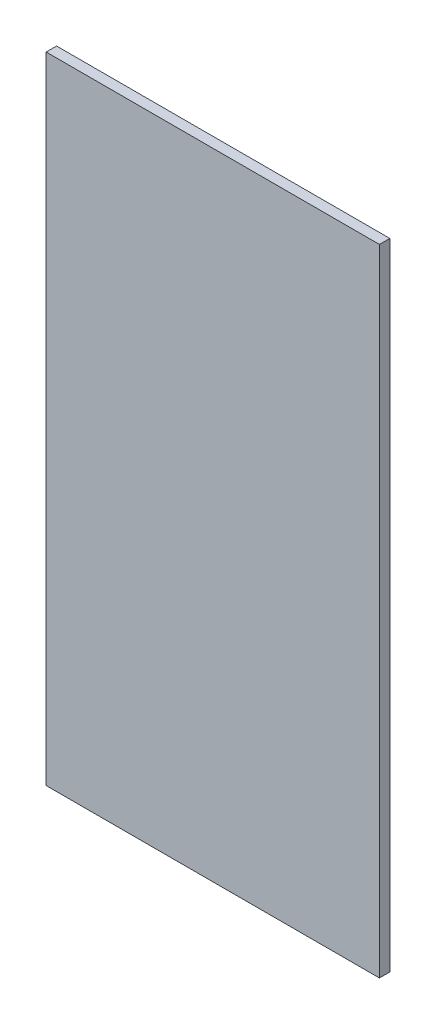
ISO-10303-21;
HEADER;
FILE_DESCRIPTION(('STEP AP214'),'2;1');
FILE_NAME('part.step','',(''),(''),'','','');
FILE_SCHEMA(('AUTOMOTIVE_DESIGN { 1 0 10303 214 1 1 1 1 }'));
ENDSEC;
DATA;
#1=APPLICATION_CONTEXT('core data for automotive mechanical design processes');
#2=APPLICATION_PROTOCOL_DEFINITION('international standard','automotive_design',2000,#1);
#3=PRODUCT_CONTEXT('',#1,'mechanical');
#4=PRODUCT('Part','Part','',(#3));
#5=PRODUCT_RELATED_PRODUCT_CATEGORY('part','',(#4));
#6=PRODUCT_DEFINITION_FORMATION('','',#4);
#7=PRODUCT_DEFINITION_CONTEXT('part definition',#1,'design');
#8=PRODUCT_DEFINITION('design','',#6,#7);
#9=PRODUCT_DEFINITION_SHAPE('','',#8);
#10=(LENGTH_UNIT() NAMED_UNIT(*) SI_UNIT(.MILLI.,.METRE.));
#11=(NAMED_UNIT(*) PLANE_ANGLE_UNIT() SI_UNIT($,.RADIAN.));
#12=(NAMED_UNIT(*) SI_UNIT($,.STERADIAN.) SOLID_ANGLE_UNIT());
#13=UNCERTAINTY_MEASURE_WITH_UNIT(LENGTH_MEASURE(1.E-05),#10,'distance_accuracy_value','');
#14=(GEOMETRIC_REPRESENTATION_CONTEXT(3) GLOBAL_UNCERTAINTY_ASSIGNED_CONTEXT((#13)) GLOBAL_UNIT_ASSIGNED_CONTEXT((#10,
#11,#12)) REPRESENTATION_CONTEXT('',''));
#15=CARTESIAN_POINT('',(0.,0.,0.));
#16=DIRECTION('',(0.,0.,1.));
#17=DIRECTION('',(1.,0.,0.));
#18=AXIS2_PLACEMENT_3D('',#15,#16,#17);
#19=CARTESIAN_POINT('',(-63.1523349436394,281.823429951691,6.35));
#20=DIRECTION('',(1.,0.,0.));
#21=DIRECTION('',(0.,1.,0.));
#22=AXIS2_PLACEMENT_3D('',#19,#20,#21);
#23=PLANE('',#22);
#24=DIRECTION('',(0.,-1.,0.));
#25=VECTOR('',#24,1.);
#26=CARTESIAN_POINT('',(-63.1523349436394,281.823429951691,0.));
#27=LINE('',#26,#25);
#28=CARTESIAN_POINT('',(-63.1523349436394,281.823429951691,0.));
#29=VERTEX_POINT('',#28);
#30=CARTESIAN_POINT('',(-63.1523349436393,-105.526570048309,0.));
#31=VERTEX_POINT('',#30);
#32=EDGE_CURVE('E96',#29,#31,#27,.T.);
#33=ORIENTED_EDGE('',*,*,#32,.T.);
#34=DIRECTION('',(0.,0.,-1.));
#35=VECTOR('',#34,1.);
#36=CARTESIAN_POINT('',(-63.1523349436393,-105.526570048309,6.35));
#37=LINE('',#36,#35);
#38=CARTESIAN_POINT('',(-63.1523349436393,-105.526570048309,6.35));
#39=VERTEX_POINT('',#38);
#40=EDGE_CURVE('E11',#39,#31,#37,.T.);
#41=ORIENTED_EDGE('',*,*,#40,.F.);
#42=DIRECTION('',(0.,-1.,0.));
#43=VECTOR('',#42,1.);
#44=CARTESIAN_POINT('',(-63.1523349436394,281.823429951691,6.35));
#45=LINE('',#44,#43);
#46=CARTESIAN_POINT('',(-63.1523349436394,281.823429951691,6.35));
#47=VERTEX_POINT('',#46);
#48=EDGE_CURVE('E84',#47,#39,#45,.T.);
#49=ORIENTED_EDGE('',*,*,#48,.F.);
#50=DIRECTION('',(0.,0.,-1.));
#51=VECTOR('',#50,1.);
#52=CARTESIAN_POINT('',(-63.1523349436394,281.823429951691,6.35));
#53=LINE('',#52,#51);
#54=EDGE_CURVE('E92',#47,#29,#53,.T.);
#55=ORIENTED_EDGE('',*,*,#54,.T.);
#56=EDGE_LOOP('',(#33,#41,#49,#55));
#57=FACE_BOUND('',#56,.T.);
#58=ADVANCED_FACE('F33',(#57),#23,.F.);
#59=CARTESIAN_POINT('',(-63.1523349436393,-105.526570048309,6.35));
#60=DIRECTION('',(0.,1.,0.));
#61=DIRECTION('',(0.,0.,1.));
#62=AXIS2_PLACEMENT_3D('',#59,#60,#61);
#63=PLANE('',#62);
#64=DIRECTION('',(1.,0.,0.));
#65=VECTOR('',#64,1.);
#66=CARTESIAN_POINT('',(-63.1523349436393,-105.526570048309,0.));
#67=LINE('',#66,#65);
#68=CARTESIAN_POINT('',(140.047665056361,-105.526570048309,0.));
#69=VERTEX_POINT('',#68);
#70=EDGE_CURVE('E88',#31,#69,#67,.T.);
#71=ORIENTED_EDGE('',*,*,#70,.T.);
#72=DIRECTION('',(0.,0.,-1.));
#73=VECTOR('',#72,1.);
#74=CARTESIAN_POINT('',(140.047665056361,-105.526570048309,6.35));
#75=LINE('',#74,#73);
#76=CARTESIAN_POINT('',(140.047665056361,-105.526570048309,6.35));
#77=VERTEX_POINT('',#76);
#78=EDGE_CURVE('E41',#77,#69,#75,.T.);
#79=ORIENTED_EDGE('',*,*,#78,.F.);
#80=DIRECTION('',(1.,0.,0.));
#81=VECTOR('',#80,1.);
#82=CARTESIAN_POINT('',(-63.1523349436393,-105.526570048309,6.35));
#83=LINE('',#82,#81);
#84=EDGE_CURVE('E79',#39,#77,#83,.T.);
#85=ORIENTED_EDGE('',*,*,#84,.F.);
#86=ORIENTED_EDGE('',*,*,#40,.T.);
#87=EDGE_LOOP('',(#71,#79,#85,#86));
#88=FACE_BOUND('',#87,.T.);
#89=ADVANCED_FACE('F87',(#88),#63,.F.);
#90=CARTESIAN_POINT('',(140.047665056361,281.823429951691,6.35));
#91=DIRECTION('',(-1.,0.,0.));
#92=DIRECTION('',(0.,-1.,0.));
#93=AXIS2_PLACEMENT_3D('',#90,#91,#92);
#94=PLANE('',#93);
#95=DIRECTION('',(0.,1.,0.));
#96=VECTOR('',#95,1.);
#97=CARTESIAN_POINT('',(140.047665056361,281.823429951691,0.));
#98=LINE('',#97,#96);
#99=CARTESIAN_POINT('',(140.047665056361,281.823429951691,0.));
#100=VERTEX_POINT('',#99);
#101=EDGE_CURVE('E66',#69,#100,#98,.T.);
#102=ORIENTED_EDGE('',*,*,#101,.T.);
#103=DIRECTION('',(0.,0.,-1.));
#104=VECTOR('',#103,1.);
#105=CARTESIAN_POINT('',(140.047665056361,281.823429951691,6.35));
#106=LINE('',#105,#104);
#107=CARTESIAN_POINT('',(140.047665056361,281.823429951691,6.35));
#108=VERTEX_POINT('',#107);
#109=EDGE_CURVE('E89',#108,#100,#106,.T.);
#110=ORIENTED_EDGE('',*,*,#109,.F.);
#111=DIRECTION('',(0.,1.,0.));
#112=VECTOR('',#111,1.);
#113=CARTESIAN_POINT('',(140.047665056361,281.823429951691,6.35));
#114=LINE('',#113,#112);
#115=EDGE_CURVE('E82',#77,#108,#114,.T.);
#116=ORIENTED_EDGE('',*,*,#115,.F.);
#117=ORIENTED_EDGE('',*,*,#78,.T.);
#118=EDGE_LOOP('',(#102,#110,#116,#117));
#119=FACE_BOUND('',#118,.T.);
#120=ADVANCED_FACE('F90',(#119),#94,.F.);
#121=CARTESIAN_POINT('',(-63.1523349436394,281.823429951691,6.35));
#122=DIRECTION('',(0.,-1.,0.));
#123=DIRECTION('',(0.,0.,-1.));
#124=AXIS2_PLACEMENT_3D('',#121,#122,#123);
#125=PLANE('',#124);
#126=DIRECTION('',(-1.,0.,0.));
#127=VECTOR('',#126,1.);
#128=CARTESIAN_POINT('',(-63.1523349436394,281.823429951691,0.));
#129=LINE('',#128,#127);
#130=EDGE_CURVE('E72',#100,#29,#129,.T.);
#131=ORIENTED_EDGE('',*,*,#130,.T.);
#132=ORIENTED_EDGE('',*,*,#54,.F.);
#133=DIRECTION('',(-1.,0.,0.));
#134=VECTOR('',#133,1.);
#135=CARTESIAN_POINT('',(-63.1523349436394,281.823429951691,6.35));
#136=LINE('',#135,#134);
#137=EDGE_CURVE('E49',#108,#47,#136,.T.);
#138=ORIENTED_EDGE('',*,*,#137,.F.);
#139=ORIENTED_EDGE('',*,*,#109,.T.);
#140=EDGE_LOOP('',(#131,#132,#138,#139));
#141=FACE_BOUND('',#140,.T.);
#142=ADVANCED_FACE('F103',(#141),#125,.F.);
#143=CARTESIAN_POINT('',(0.,0.,6.35));
#144=DIRECTION('',(0.,0.,1.));
#145=DIRECTION('',(1.,0.,0.));
#146=AXIS2_PLACEMENT_3D('',#143,#144,#145);
#147=PLANE('',#146);
#148=ORIENTED_EDGE('',*,*,#48,.T.);
#149=ORIENTED_EDGE('',*,*,#84,.T.);
#150=ORIENTED_EDGE('',*,*,#115,.T.);
#151=ORIENTED_EDGE('',*,*,#137,.T.);
#152=EDGE_LOOP('',(#148,#149,#150,#151));
#153=FACE_BOUND('',#152,.T.);
#154=ADVANCED_FACE('F80',(#153),#147,.T.);
#155=CARTESIAN_POINT('',(0.,0.,0.));
#156=DIRECTION('',(0.,0.,1.));
#157=DIRECTION('',(1.,0.,0.));
#158=AXIS2_PLACEMENT_3D('',#155,#156,#157);
#159=PLANE('',#158);
#160=ORIENTED_EDGE('',*,*,#32,.F.);
#161=ORIENTED_EDGE('',*,*,#130,.F.);
#162=ORIENTED_EDGE('',*,*,#101,.F.);
#163=ORIENTED_EDGE('',*,*,#70,.F.);
#164=EDGE_LOOP('',(#160,#161,#162,#163));
#165=FACE_BOUND('',#164,.T.);
#166=ADVANCED_FACE('F106',(#165),#159,.F.);
#167=CLOSED_SHELL('',(#58,#89,#120,#142,#154,#166));
#168=MANIFOLD_SOLID_BREP('B2',#167);
#169=ADVANCED_BREP_SHAPE_REPRESENTATION('',(#18,#168),#14);
#170=SHAPE_DEFINITION_REPRESENTATION(#9,#169);
ENDSEC;
END-ISO-10303-21;
